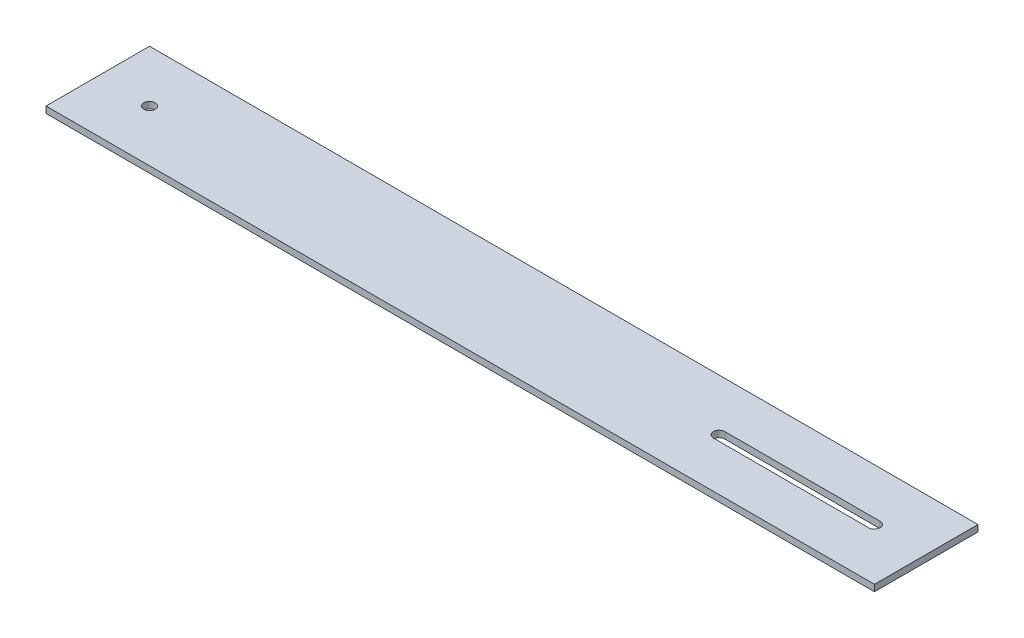
ISO-10303-21;
HEADER;
FILE_DESCRIPTION(('STEP AP214'),'2;1');
FILE_NAME('part.step','',(''),(''),'','','');
FILE_SCHEMA(('AUTOMOTIVE_DESIGN { 1 0 10303 214 1 1 1 1 }'));
ENDSEC;
DATA;
#1=APPLICATION_CONTEXT('core data for automotive mechanical design processes');
#2=APPLICATION_PROTOCOL_DEFINITION('international standard','automotive_design',2000,#1);
#3=PRODUCT_CONTEXT('',#1,'mechanical');
#4=PRODUCT('Part','Part','',(#3));
#5=PRODUCT_RELATED_PRODUCT_CATEGORY('part','',(#4));
#6=PRODUCT_DEFINITION_FORMATION('','',#4);
#7=PRODUCT_DEFINITION_CONTEXT('part definition',#1,'design');
#8=PRODUCT_DEFINITION('design','',#6,#7);
#9=PRODUCT_DEFINITION_SHAPE('','',#8);
#10=(LENGTH_UNIT() NAMED_UNIT(*) SI_UNIT(.MILLI.,.METRE.));
#11=(NAMED_UNIT(*) PLANE_ANGLE_UNIT() SI_UNIT($,.RADIAN.));
#12=(NAMED_UNIT(*) SI_UNIT($,.STERADIAN.) SOLID_ANGLE_UNIT());
#13=UNCERTAINTY_MEASURE_WITH_UNIT(LENGTH_MEASURE(1.E-05),#10,'distance_accuracy_value','');
#14=(GEOMETRIC_REPRESENTATION_CONTEXT(3) GLOBAL_UNCERTAINTY_ASSIGNED_CONTEXT((#13)) GLOBAL_UNIT_ASSIGNED_CONTEXT((#10,
#11,#12)) REPRESENTATION_CONTEXT('',''));
#15=CARTESIAN_POINT('',(0.,0.,0.));
#16=DIRECTION('',(0.,0.,1.));
#17=DIRECTION('',(1.,0.,0.));
#18=AXIS2_PLACEMENT_3D('',#15,#16,#17);
#19=CARTESIAN_POINT('',(0.,3.175,0.));
#20=DIRECTION('',(0.,-1.,0.));
#21=DIRECTION('',(0.,0.,-1.));
#22=AXIS2_PLACEMENT_3D('',#19,#20,#21);
#23=PLANE('',#22);
#24=CARTESIAN_POINT('',(25.4,3.175,-25.4));
#25=DIRECTION('',(0.,1.,0.));
#26=DIRECTION('',(0.,0.,1.));
#27=AXIS2_PLACEMENT_3D('',#24,#25,#26);
#28=CIRCLE('',#27,2.778125);
#29=CARTESIAN_POINT('',(25.4,3.175,-22.621875));
#30=VERTEX_POINT('',#29);
#31=EDGE_CURVE('E134',#30,#30,#28,.T.);
#32=ORIENTED_EDGE('',*,*,#31,.F.);
#33=EDGE_LOOP('',(#32));
#34=FACE_BOUND('',#33,.T.);
#35=DIRECTION('',(0.,0.,1.));
#36=VECTOR('',#35,1.);
#37=CARTESIAN_POINT('',(0.,3.175,0.));
#38=LINE('',#37,#36);
#39=CARTESIAN_POINT('',(0.,3.175,-50.8));
#40=VERTEX_POINT('',#39);
#41=CARTESIAN_POINT('',(0.,3.175,0.));
#42=VERTEX_POINT('',#41);
#43=EDGE_CURVE('E140',#40,#42,#38,.T.);
#44=ORIENTED_EDGE('',*,*,#43,.T.);
#45=DIRECTION('',(1.,0.,0.));
#46=VECTOR('',#45,1.);
#47=CARTESIAN_POINT('',(0.,3.175,0.));
#48=LINE('',#47,#46);
#49=CARTESIAN_POINT('',(406.4,3.175,0.));
#50=VERTEX_POINT('',#49);
#51=EDGE_CURVE('E143',#42,#50,#48,.T.);
#52=ORIENTED_EDGE('',*,*,#51,.T.);
#53=DIRECTION('',(0.,0.,-1.));
#54=VECTOR('',#53,1.);
#55=CARTESIAN_POINT('',(406.4,3.175,0.));
#56=LINE('',#55,#54);
#57=CARTESIAN_POINT('',(406.4,3.175,-50.8));
#58=VERTEX_POINT('',#57);
#59=EDGE_CURVE('E146',#50,#58,#56,.T.);
#60=ORIENTED_EDGE('',*,*,#59,.T.);
#61=DIRECTION('',(-1.,0.,0.));
#62=VECTOR('',#61,1.);
#63=CARTESIAN_POINT('',(0.,3.175,-50.8));
#64=LINE('',#63,#62);
#65=EDGE_CURVE('E148',#58,#40,#64,.T.);
#66=ORIENTED_EDGE('',*,*,#65,.T.);
#67=EDGE_LOOP('',(#44,#52,#60,#66));
#68=FACE_BOUND('',#67,.T.);
#69=CARTESIAN_POINT('',(304.8,3.175,-25.4));
#70=DIRECTION('',(0.,1.,0.));
#71=DIRECTION('',(0.,0.,1.));
#72=AXIS2_PLACEMENT_3D('',#69,#70,#71);
#73=CIRCLE('',#72,2.77812500000002);
#74=CARTESIAN_POINT('',(304.8,3.175,-28.178125));
#75=VERTEX_POINT('',#74);
#76=CARTESIAN_POINT('',(304.8,3.175,-22.621875));
#77=VERTEX_POINT('',#76);
#78=EDGE_CURVE('E98',#75,#77,#73,.T.);
#79=ORIENTED_EDGE('',*,*,#78,.F.);
#80=DIRECTION('',(-1.,0.,0.));
#81=VECTOR('',#80,1.);
#82=CARTESIAN_POINT('',(304.8,3.175,-28.178125));
#83=LINE('',#82,#81);
#84=CARTESIAN_POINT('',(381.,3.175,-28.178125));
#85=VERTEX_POINT('',#84);
#86=EDGE_CURVE('E120',#85,#75,#83,.T.);
#87=ORIENTED_EDGE('',*,*,#86,.F.);
#88=CARTESIAN_POINT('',(381.,3.175,-25.4));
#89=DIRECTION('',(0.,1.,0.));
#90=DIRECTION('',(0.,0.,1.));
#91=AXIS2_PLACEMENT_3D('',#88,#89,#90);
#92=CIRCLE('',#91,2.77812500000002);
#93=CARTESIAN_POINT('',(381.,3.175,-22.621875));
#94=VERTEX_POINT('',#93);
#95=EDGE_CURVE('E118',#94,#85,#92,.T.);
#96=ORIENTED_EDGE('',*,*,#95,.F.);
#97=DIRECTION('',(1.,0.,0.));
#98=VECTOR('',#97,1.);
#99=CARTESIAN_POINT('',(304.8,3.175,-22.621875));
#100=LINE('',#99,#98);
#101=EDGE_CURVE('E106',#77,#94,#100,.T.);
#102=ORIENTED_EDGE('',*,*,#101,.F.);
#103=EDGE_LOOP('',(#79,#87,#96,#102));
#104=FACE_BOUND('',#103,.T.);
#105=ADVANCED_FACE('F33',(#34,#68,#104),#23,.F.);
#106=CARTESIAN_POINT('',(0.,0.,0.));
#107=DIRECTION('',(0.,-1.,0.));
#108=DIRECTION('',(0.,0.,-1.));
#109=AXIS2_PLACEMENT_3D('',#106,#107,#108);
#110=PLANE('',#109);
#111=DIRECTION('',(0.,0.,1.));
#112=VECTOR('',#111,1.);
#113=CARTESIAN_POINT('',(0.,0.,0.));
#114=LINE('',#113,#112);
#115=CARTESIAN_POINT('',(0.,0.,-50.8));
#116=VERTEX_POINT('',#115);
#117=CARTESIAN_POINT('',(0.,0.,0.));
#118=VERTEX_POINT('',#117);
#119=EDGE_CURVE('E137',#116,#118,#114,.T.);
#120=ORIENTED_EDGE('',*,*,#119,.F.);
#121=DIRECTION('',(-1.,0.,0.));
#122=VECTOR('',#121,1.);
#123=CARTESIAN_POINT('',(0.,0.,-50.8));
#124=LINE('',#123,#122);
#125=CARTESIAN_POINT('',(406.4,0.,-50.8));
#126=VERTEX_POINT('',#125);
#127=EDGE_CURVE('E144',#126,#116,#124,.T.);
#128=ORIENTED_EDGE('',*,*,#127,.F.);
#129=DIRECTION('',(0.,0.,-1.));
#130=VECTOR('',#129,1.);
#131=CARTESIAN_POINT('',(406.4,0.,0.));
#132=LINE('',#131,#130);
#133=CARTESIAN_POINT('',(406.4,0.,0.));
#134=VERTEX_POINT('',#133);
#135=EDGE_CURVE('E155',#134,#126,#132,.T.);
#136=ORIENTED_EDGE('',*,*,#135,.F.);
#137=DIRECTION('',(1.,0.,0.));
#138=VECTOR('',#137,1.);
#139=CARTESIAN_POINT('',(0.,0.,0.));
#140=LINE('',#139,#138);
#141=EDGE_CURVE('E153',#118,#134,#140,.T.);
#142=ORIENTED_EDGE('',*,*,#141,.F.);
#143=EDGE_LOOP('',(#120,#128,#136,#142));
#144=FACE_BOUND('',#143,.T.);
#145=CARTESIAN_POINT('',(25.4,0.,-25.4));
#146=DIRECTION('',(0.,1.,0.));
#147=DIRECTION('',(0.,0.,1.));
#148=AXIS2_PLACEMENT_3D('',#145,#146,#147);
#149=CIRCLE('',#148,2.778125);
#150=CARTESIAN_POINT('',(25.4,0.,-22.621875));
#151=VERTEX_POINT('',#150);
#152=EDGE_CURVE('E114',#151,#151,#149,.T.);
#153=ORIENTED_EDGE('',*,*,#152,.T.);
#154=EDGE_LOOP('',(#153));
#155=FACE_BOUND('',#154,.T.);
#156=DIRECTION('',(-1.,0.,0.));
#157=VECTOR('',#156,1.);
#158=CARTESIAN_POINT('',(304.8,0.,-28.178125));
#159=LINE('',#158,#157);
#160=CARTESIAN_POINT('',(381.,0.,-28.178125));
#161=VERTEX_POINT('',#160);
#162=CARTESIAN_POINT('',(304.8,0.,-28.178125));
#163=VERTEX_POINT('',#162);
#164=EDGE_CURVE('E107',#161,#163,#159,.T.);
#165=ORIENTED_EDGE('',*,*,#164,.T.);
#166=CARTESIAN_POINT('',(304.8,0.,-25.4));
#167=DIRECTION('',(0.,1.,0.));
#168=DIRECTION('',(0.,0.,1.));
#169=AXIS2_PLACEMENT_3D('',#166,#167,#168);
#170=CIRCLE('',#169,2.77812500000002);
#171=CARTESIAN_POINT('',(304.8,0.,-22.621875));
#172=VERTEX_POINT('',#171);
#173=EDGE_CURVE('E56',#163,#172,#170,.T.);
#174=ORIENTED_EDGE('',*,*,#173,.T.);
#175=DIRECTION('',(1.,0.,0.));
#176=VECTOR('',#175,1.);
#177=CARTESIAN_POINT('',(304.8,0.,-22.621875));
#178=LINE('',#177,#176);
#179=CARTESIAN_POINT('',(381.,0.,-22.621875));
#180=VERTEX_POINT('',#179);
#181=EDGE_CURVE('E113',#172,#180,#178,.T.);
#182=ORIENTED_EDGE('',*,*,#181,.T.);
#183=CARTESIAN_POINT('',(381.,0.,-25.4));
#184=DIRECTION('',(0.,1.,0.));
#185=DIRECTION('',(0.,0.,1.));
#186=AXIS2_PLACEMENT_3D('',#183,#184,#185);
#187=CIRCLE('',#186,2.77812500000002);
#188=EDGE_CURVE('E126',#180,#161,#187,.T.);
#189=ORIENTED_EDGE('',*,*,#188,.T.);
#190=EDGE_LOOP('',(#165,#174,#182,#189));
#191=FACE_BOUND('',#190,.T.);
#192=ADVANCED_FACE('F173',(#144,#155,#191),#110,.T.);
#193=CARTESIAN_POINT('',(0.,3.175,0.));
#194=DIRECTION('',(1.,0.,0.));
#195=DIRECTION('',(0.,0.,-1.));
#196=AXIS2_PLACEMENT_3D('',#193,#194,#195);
#197=PLANE('',#196);
#198=ORIENTED_EDGE('',*,*,#119,.T.);
#199=DIRECTION('',(0.,-1.,0.));
#200=VECTOR('',#199,1.);
#201=CARTESIAN_POINT('',(0.,3.175,0.));
#202=LINE('',#201,#200);
#203=EDGE_CURVE('E11',#42,#118,#202,.T.);
#204=ORIENTED_EDGE('',*,*,#203,.F.);
#205=ORIENTED_EDGE('',*,*,#43,.F.);
#206=DIRECTION('',(0.,-1.,0.));
#207=VECTOR('',#206,1.);
#208=CARTESIAN_POINT('',(0.,3.175,-50.8));
#209=LINE('',#208,#207);
#210=EDGE_CURVE('E150',#40,#116,#209,.T.);
#211=ORIENTED_EDGE('',*,*,#210,.T.);
#212=EDGE_LOOP('',(#198,#204,#205,#211));
#213=FACE_BOUND('',#212,.T.);
#214=ADVANCED_FACE('F35',(#213),#197,.F.);
#215=CARTESIAN_POINT('',(0.,3.175,0.));
#216=DIRECTION('',(0.,0.,-1.));
#217=DIRECTION('',(-1.,0.,0.));
#218=AXIS2_PLACEMENT_3D('',#215,#216,#217);
#219=PLANE('',#218);
#220=ORIENTED_EDGE('',*,*,#141,.T.);
#221=DIRECTION('',(0.,-1.,0.));
#222=VECTOR('',#221,1.);
#223=CARTESIAN_POINT('',(406.4,3.175,0.));
#224=LINE('',#223,#222);
#225=EDGE_CURVE('E41',#50,#134,#224,.T.);
#226=ORIENTED_EDGE('',*,*,#225,.F.);
#227=ORIENTED_EDGE('',*,*,#51,.F.);
#228=ORIENTED_EDGE('',*,*,#203,.T.);
#229=EDGE_LOOP('',(#220,#226,#227,#228));
#230=FACE_BOUND('',#229,.T.);
#231=ADVANCED_FACE('F183',(#230),#219,.F.);
#232=CARTESIAN_POINT('',(406.4,3.175,0.));
#233=DIRECTION('',(-1.,0.,0.));
#234=DIRECTION('',(0.,0.,1.));
#235=AXIS2_PLACEMENT_3D('',#232,#233,#234);
#236=PLANE('',#235);
#237=ORIENTED_EDGE('',*,*,#135,.T.);
#238=DIRECTION('',(0.,-1.,0.));
#239=VECTOR('',#238,1.);
#240=CARTESIAN_POINT('',(406.4,3.175,-50.8));
#241=LINE('',#240,#239);
#242=EDGE_CURVE('E160',#58,#126,#241,.T.);
#243=ORIENTED_EDGE('',*,*,#242,.F.);
#244=ORIENTED_EDGE('',*,*,#59,.F.);
#245=ORIENTED_EDGE('',*,*,#225,.T.);
#246=EDGE_LOOP('',(#237,#243,#244,#245));
#247=FACE_BOUND('',#246,.T.);
#248=ADVANCED_FACE('F167',(#247),#236,.F.);
#249=CARTESIAN_POINT('',(0.,3.175,-50.8));
#250=DIRECTION('',(0.,0.,1.));
#251=DIRECTION('',(1.,0.,0.));
#252=AXIS2_PLACEMENT_3D('',#249,#250,#251);
#253=PLANE('',#252);
#254=ORIENTED_EDGE('',*,*,#127,.T.);
#255=ORIENTED_EDGE('',*,*,#210,.F.);
#256=ORIENTED_EDGE('',*,*,#65,.F.);
#257=ORIENTED_EDGE('',*,*,#242,.T.);
#258=EDGE_LOOP('',(#254,#255,#256,#257));
#259=FACE_BOUND('',#258,.T.);
#260=ADVANCED_FACE('F177',(#259),#253,.F.);
#261=CARTESIAN_POINT('',(25.4,3.175,-25.4));
#262=DIRECTION('',(0.,-1.,0.));
#263=DIRECTION('',(0.,0.,-1.));
#264=AXIS2_PLACEMENT_3D('',#261,#262,#263);
#265=CYLINDRICAL_SURFACE('',#264,2.778125);
#266=ORIENTED_EDGE('',*,*,#31,.T.);
#267=EDGE_LOOP('',(#266));
#268=FACE_BOUND('',#267,.T.);
#269=ORIENTED_EDGE('',*,*,#152,.F.);
#270=EDGE_LOOP('',(#269));
#271=FACE_BOUND('',#270,.T.);
#272=ADVANCED_FACE('F199',(#268,#271),#265,.F.);
#273=CARTESIAN_POINT('',(304.8,3.175,-25.4));
#274=DIRECTION('',(0.,-1.,0.));
#275=DIRECTION('',(0.,0.,-1.));
#276=AXIS2_PLACEMENT_3D('',#273,#274,#275);
#277=CYLINDRICAL_SURFACE('',#276,2.77812500000002);
#278=ORIENTED_EDGE('',*,*,#173,.F.);
#279=DIRECTION('',(0.,-1.,0.));
#280=VECTOR('',#279,1.);
#281=CARTESIAN_POINT('',(304.8,3.175,-28.178125));
#282=LINE('',#281,#280);
#283=EDGE_CURVE('E102',#75,#163,#282,.T.);
#284=ORIENTED_EDGE('',*,*,#283,.F.);
#285=ORIENTED_EDGE('',*,*,#78,.T.);
#286=DIRECTION('',(0.,-1.,0.));
#287=VECTOR('',#286,1.);
#288=CARTESIAN_POINT('',(304.8,3.175,-22.621875));
#289=LINE('',#288,#287);
#290=EDGE_CURVE('E101',#77,#172,#289,.T.);
#291=ORIENTED_EDGE('',*,*,#290,.T.);
#292=EDGE_LOOP('',(#278,#284,#285,#291));
#293=FACE_BOUND('',#292,.T.);
#294=ADVANCED_FACE('F100',(#293),#277,.F.);
#295=CARTESIAN_POINT('',(304.8,3.175,-22.621875));
#296=DIRECTION('',(0.,0.,-1.));
#297=DIRECTION('',(-1.,0.,0.));
#298=AXIS2_PLACEMENT_3D('',#295,#296,#297);
#299=PLANE('',#298);
#300=ORIENTED_EDGE('',*,*,#181,.F.);
#301=ORIENTED_EDGE('',*,*,#290,.F.);
#302=ORIENTED_EDGE('',*,*,#101,.T.);
#303=DIRECTION('',(0.,-1.,0.));
#304=VECTOR('',#303,1.);
#305=CARTESIAN_POINT('',(381.,3.175,-22.621875));
#306=LINE('',#305,#304);
#307=EDGE_CURVE('E115',#94,#180,#306,.T.);
#308=ORIENTED_EDGE('',*,*,#307,.T.);
#309=EDGE_LOOP('',(#300,#301,#302,#308));
#310=FACE_BOUND('',#309,.T.);
#311=ADVANCED_FACE('F110',(#310),#299,.T.);
#312=CARTESIAN_POINT('',(381.,3.175,-25.4));
#313=DIRECTION('',(0.,-1.,0.));
#314=DIRECTION('',(0.,0.,-1.));
#315=AXIS2_PLACEMENT_3D('',#312,#313,#314);
#316=CYLINDRICAL_SURFACE('',#315,2.77812500000002);
#317=ORIENTED_EDGE('',*,*,#188,.F.);
#318=ORIENTED_EDGE('',*,*,#307,.F.);
#319=ORIENTED_EDGE('',*,*,#95,.T.);
#320=DIRECTION('',(0.,-1.,0.));
#321=VECTOR('',#320,1.);
#322=CARTESIAN_POINT('',(381.,3.175,-28.178125));
#323=LINE('',#322,#321);
#324=EDGE_CURVE('E48',#85,#161,#323,.T.);
#325=ORIENTED_EDGE('',*,*,#324,.T.);
#326=EDGE_LOOP('',(#317,#318,#319,#325));
#327=FACE_BOUND('',#326,.T.);
#328=ADVANCED_FACE('F216',(#327),#316,.F.);
#329=CARTESIAN_POINT('',(304.8,3.175,-28.178125));
#330=DIRECTION('',(0.,0.,1.));
#331=DIRECTION('',(1.,0.,0.));
#332=AXIS2_PLACEMENT_3D('',#329,#330,#331);
#333=PLANE('',#332);
#334=ORIENTED_EDGE('',*,*,#164,.F.);
#335=ORIENTED_EDGE('',*,*,#324,.F.);
#336=ORIENTED_EDGE('',*,*,#86,.T.);
#337=ORIENTED_EDGE('',*,*,#283,.T.);
#338=EDGE_LOOP('',(#334,#335,#336,#337));
#339=FACE_BOUND('',#338,.T.);
#340=ADVANCED_FACE('F214',(#339),#333,.T.);
#341=CLOSED_SHELL('',(#105,#192,#214,#231,#248,#260,#272,#294,#311,#328,#340));
#342=MANIFOLD_SOLID_BREP('B2',#341);
#343=ADVANCED_BREP_SHAPE_REPRESENTATION('',(#18,#342),#14);
#344=SHAPE_DEFINITION_REPRESENTATION(#9,#343);
ENDSEC;
END-ISO-10303-21;
